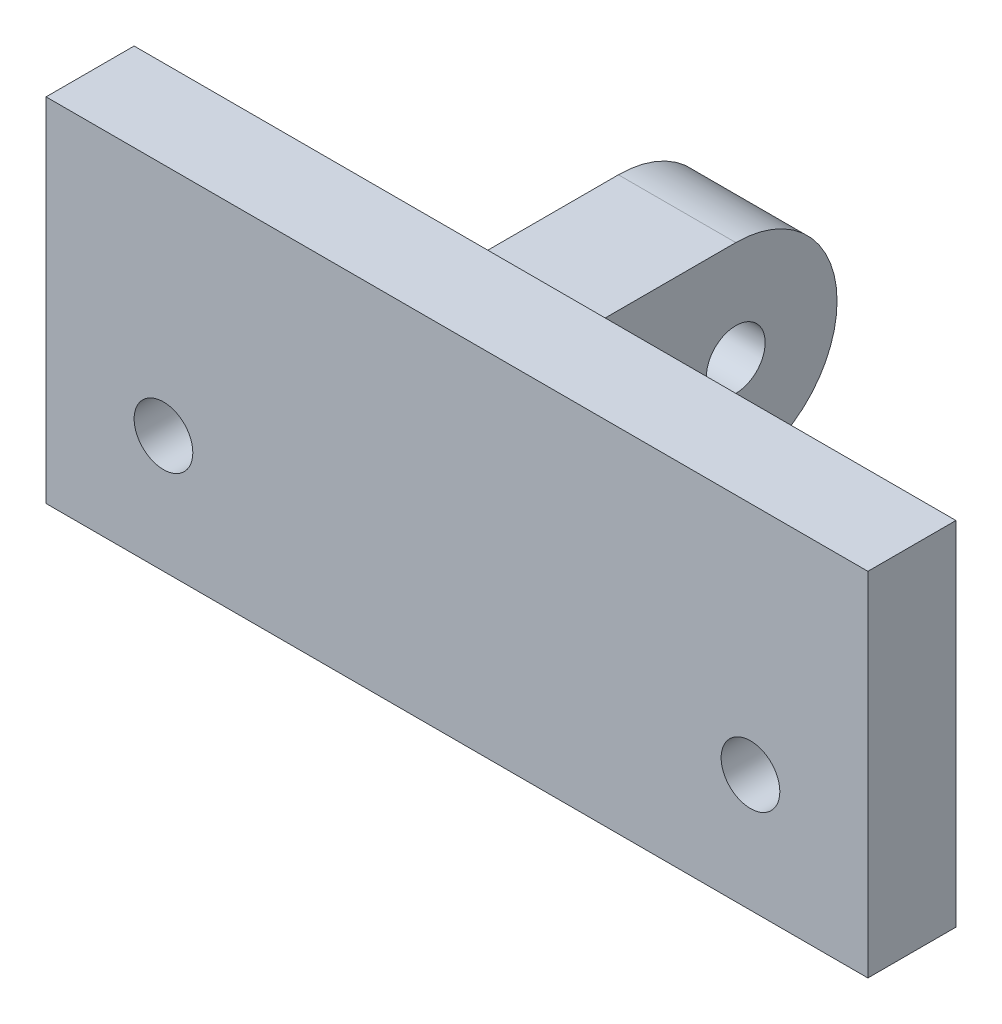
ISO-10303-21;
HEADER;
FILE_DESCRIPTION(('STEP AP214'),'2;1');
FILE_NAME('part.step','',(''),(''),'','','');
FILE_SCHEMA(('AUTOMOTIVE_DESIGN { 1 0 10303 214 1 1 1 1 }'));
ENDSEC;
DATA;
#1=APPLICATION_CONTEXT('core data for automotive mechanical design processes');
#2=APPLICATION_PROTOCOL_DEFINITION('international standard','automotive_design',2000,#1);
#3=PRODUCT_CONTEXT('',#1,'mechanical');
#4=PRODUCT('Part','Part','',(#3));
#5=PRODUCT_RELATED_PRODUCT_CATEGORY('part','',(#4));
#6=PRODUCT_DEFINITION_FORMATION('','',#4);
#7=PRODUCT_DEFINITION_CONTEXT('part definition',#1,'design');
#8=PRODUCT_DEFINITION('design','',#6,#7);
#9=PRODUCT_DEFINITION_SHAPE('','',#8);
#10=(LENGTH_UNIT() NAMED_UNIT(*) SI_UNIT(.MILLI.,.METRE.));
#11=(NAMED_UNIT(*) PLANE_ANGLE_UNIT() SI_UNIT($,.RADIAN.));
#12=(NAMED_UNIT(*) SI_UNIT($,.STERADIAN.) SOLID_ANGLE_UNIT());
#13=UNCERTAINTY_MEASURE_WITH_UNIT(LENGTH_MEASURE(1.E-05),#10,'distance_accuracy_value','');
#14=(GEOMETRIC_REPRESENTATION_CONTEXT(3) GLOBAL_UNCERTAINTY_ASSIGNED_CONTEXT((#13)) GLOBAL_UNIT_ASSIGNED_CONTEXT((#10,
#11,#12)) REPRESENTATION_CONTEXT('',''));
#15=CARTESIAN_POINT('',(0.,0.,0.));
#16=DIRECTION('',(0.,0.,1.));
#17=DIRECTION('',(1.,0.,0.));
#18=AXIS2_PLACEMENT_3D('',#15,#16,#17);
#19=CARTESIAN_POINT('',(0.,0.,0.));
#20=DIRECTION('',(0.,0.,1.));
#21=DIRECTION('',(1.,0.,0.));
#22=AXIS2_PLACEMENT_3D('',#19,#20,#21);
#23=PLANE('',#22);
#24=DIRECTION('',(0.,-1.,0.));
#25=VECTOR('',#24,1.);
#26=CARTESIAN_POINT('',(-30.4122255040452,13.3566433566434,0.));
#27=LINE('',#26,#25);
#28=CARTESIAN_POINT('',(-30.4122255040452,13.3566433566434,0.));
#29=VERTEX_POINT('',#28);
#30=CARTESIAN_POINT('',(-30.4122255040452,1.35664335664336,0.));
#31=VERTEX_POINT('',#30);
#32=EDGE_CURVE('E153',#29,#31,#27,.T.);
#33=ORIENTED_EDGE('',*,*,#32,.F.);
#34=DIRECTION('',(-1.,0.,0.));
#35=VECTOR('',#34,1.);
#36=CARTESIAN_POINT('',(-30.4122255040452,13.3566433566434,0.));
#37=LINE('',#36,#35);
#38=CARTESIAN_POINT('',(-2.41222550404521,13.3566433566434,0.));
#39=VERTEX_POINT('',#38);
#40=EDGE_CURVE('E37',#39,#29,#37,.T.);
#41=ORIENTED_EDGE('',*,*,#40,.F.);
#42=DIRECTION('',(0.,1.,0.));
#43=VECTOR('',#42,1.);
#44=CARTESIAN_POINT('',(-2.41222550404521,13.3566433566434,0.));
#45=LINE('',#44,#43);
#46=CARTESIAN_POINT('',(-2.41222550404521,1.35664335664336,0.));
#47=VERTEX_POINT('',#46);
#48=EDGE_CURVE('E170',#47,#39,#45,.T.);
#49=ORIENTED_EDGE('',*,*,#48,.F.);
#50=DIRECTION('',(1.,0.,0.));
#51=VECTOR('',#50,1.);
#52=CARTESIAN_POINT('',(-30.4122255040452,1.35664335664336,0.));
#53=LINE('',#52,#51);
#54=EDGE_CURVE('E168',#31,#47,#53,.T.);
#55=ORIENTED_EDGE('',*,*,#54,.F.);
#56=EDGE_LOOP('',(#33,#41,#49,#55));
#57=FACE_BOUND('',#56,.T.);
#58=CARTESIAN_POINT('',(-26.4122255040452,5.35664335664336,0.));
#59=DIRECTION('',(0.,0.,1.));
#60=DIRECTION('',(1.,0.,0.));
#61=AXIS2_PLACEMENT_3D('',#58,#59,#60);
#62=CIRCLE('',#61,1.);
#63=CARTESIAN_POINT('',(-25.4122255040452,5.35664335664336,0.));
#64=VERTEX_POINT('',#63);
#65=EDGE_CURVE('E150',#64,#64,#62,.T.);
#66=ORIENTED_EDGE('',*,*,#65,.T.);
#67=EDGE_LOOP('',(#66));
#68=FACE_BOUND('',#67,.T.);
#69=CARTESIAN_POINT('',(-6.41222550404521,5.35664335664336,0.));
#70=DIRECTION('',(0.,0.,1.));
#71=DIRECTION('',(1.,0.,0.));
#72=AXIS2_PLACEMENT_3D('',#69,#70,#71);
#73=CIRCLE('',#72,1.);
#74=CARTESIAN_POINT('',(-5.41222550404521,5.35664335664336,0.));
#75=VERTEX_POINT('',#74);
#76=EDGE_CURVE('E144',#75,#75,#73,.T.);
#77=ORIENTED_EDGE('',*,*,#76,.T.);
#78=EDGE_LOOP('',(#77));
#79=FACE_BOUND('',#78,.T.);
#80=DIRECTION('',(0.,-1.,0.));
#81=VECTOR('',#80,1.);
#82=CARTESIAN_POINT('',(-14.4122255040452,13.3066433566434,0.));
#83=LINE('',#82,#81);
#84=CARTESIAN_POINT('',(-14.4122255040452,13.3066433566434,0.));
#85=VERTEX_POINT('',#84);
#86=CARTESIAN_POINT('',(-14.4122255040452,6.40664335664336,0.));
#87=VERTEX_POINT('',#86);
#88=EDGE_CURVE('E114',#85,#87,#83,.T.);
#89=ORIENTED_EDGE('',*,*,#88,.F.);
#90=DIRECTION('',(-1.,0.,0.));
#91=VECTOR('',#90,1.);
#92=CARTESIAN_POINT('',(-9.91222550404521,13.3066433566434,0.));
#93=LINE('',#92,#91);
#94=CARTESIAN_POINT('',(-18.4122255040452,13.3066433566434,0.));
#95=VERTEX_POINT('',#94);
#96=EDGE_CURVE('E50',#85,#95,#93,.T.);
#97=ORIENTED_EDGE('',*,*,#96,.T.);
#98=DIRECTION('',(0.,1.,0.));
#99=VECTOR('',#98,1.);
#100=CARTESIAN_POINT('',(-18.4122255040452,6.40664335664336,0.));
#101=LINE('',#100,#99);
#102=CARTESIAN_POINT('',(-18.4122255040452,6.40664335664336,0.));
#103=VERTEX_POINT('',#102);
#104=EDGE_CURVE('E135',#103,#95,#101,.T.);
#105=ORIENTED_EDGE('',*,*,#104,.F.);
#106=DIRECTION('',(-1.,0.,0.));
#107=VECTOR('',#106,1.);
#108=CARTESIAN_POINT('',(-9.91222550404521,6.40664335664336,0.));
#109=LINE('',#108,#107);
#110=EDGE_CURVE('E57',#87,#103,#109,.T.);
#111=ORIENTED_EDGE('',*,*,#110,.F.);
#112=EDGE_LOOP('',(#89,#97,#105,#111));
#113=FACE_BOUND('',#112,.T.);
#114=ADVANCED_FACE('F33',(#57,#68,#79,#113),#23,.F.);
#115=CARTESIAN_POINT('',(-30.4122255040452,13.3566433566434,3.));
#116=DIRECTION('',(1.,0.,0.));
#117=DIRECTION('',(0.,0.,-1.));
#118=AXIS2_PLACEMENT_3D('',#115,#116,#117);
#119=PLANE('',#118);
#120=ORIENTED_EDGE('',*,*,#32,.T.);
#121=DIRECTION('',(0.,0.,-1.));
#122=VECTOR('',#121,1.);
#123=CARTESIAN_POINT('',(-30.4122255040452,1.35664335664336,3.));
#124=LINE('',#123,#122);
#125=CARTESIAN_POINT('',(-30.4122255040452,1.35664335664336,3.));
#126=VERTEX_POINT('',#125);
#127=EDGE_CURVE('E11',#126,#31,#124,.T.);
#128=ORIENTED_EDGE('',*,*,#127,.F.);
#129=DIRECTION('',(0.,-1.,0.));
#130=VECTOR('',#129,1.);
#131=CARTESIAN_POINT('',(-30.4122255040452,13.3566433566434,3.));
#132=LINE('',#131,#130);
#133=CARTESIAN_POINT('',(-30.4122255040452,13.3566433566434,3.));
#134=VERTEX_POINT('',#133);
#135=EDGE_CURVE('E156',#134,#126,#132,.T.);
#136=ORIENTED_EDGE('',*,*,#135,.F.);
#137=DIRECTION('',(0.,0.,-1.));
#138=VECTOR('',#137,1.);
#139=CARTESIAN_POINT('',(-30.4122255040452,13.3566433566434,3.));
#140=LINE('',#139,#138);
#141=EDGE_CURVE('E165',#134,#29,#140,.T.);
#142=ORIENTED_EDGE('',*,*,#141,.T.);
#143=EDGE_LOOP('',(#120,#128,#136,#142));
#144=FACE_BOUND('',#143,.T.);
#145=ADVANCED_FACE('F35',(#144),#119,.F.);
#146=CARTESIAN_POINT('',(-30.4122255040452,1.35664335664336,3.));
#147=DIRECTION('',(0.,1.,0.));
#148=DIRECTION('',(0.,0.,1.));
#149=AXIS2_PLACEMENT_3D('',#146,#147,#148);
#150=PLANE('',#149);
#151=ORIENTED_EDGE('',*,*,#54,.T.);
#152=DIRECTION('',(0.,0.,-1.));
#153=VECTOR('',#152,1.);
#154=CARTESIAN_POINT('',(-2.41222550404521,1.35664335664336,3.));
#155=LINE('',#154,#153);
#156=CARTESIAN_POINT('',(-2.41222550404521,1.35664335664336,3.));
#157=VERTEX_POINT('',#156);
#158=EDGE_CURVE('E43',#157,#47,#155,.T.);
#159=ORIENTED_EDGE('',*,*,#158,.F.);
#160=DIRECTION('',(1.,0.,0.));
#161=VECTOR('',#160,1.);
#162=CARTESIAN_POINT('',(-30.4122255040452,1.35664335664336,3.));
#163=LINE('',#162,#161);
#164=EDGE_CURVE('E159',#126,#157,#163,.T.);
#165=ORIENTED_EDGE('',*,*,#164,.F.);
#166=ORIENTED_EDGE('',*,*,#127,.T.);
#167=EDGE_LOOP('',(#151,#159,#165,#166));
#168=FACE_BOUND('',#167,.T.);
#169=ADVANCED_FACE('F199',(#168),#150,.F.);
#170=CARTESIAN_POINT('',(-2.41222550404521,13.3566433566434,3.));
#171=DIRECTION('',(-1.,0.,0.));
#172=DIRECTION('',(0.,0.,1.));
#173=AXIS2_PLACEMENT_3D('',#170,#171,#172);
#174=PLANE('',#173);
#175=ORIENTED_EDGE('',*,*,#48,.T.);
#176=DIRECTION('',(0.,0.,-1.));
#177=VECTOR('',#176,1.);
#178=CARTESIAN_POINT('',(-2.41222550404521,13.3566433566434,3.));
#179=LINE('',#178,#177);
#180=CARTESIAN_POINT('',(-2.41222550404521,13.3566433566434,3.));
#181=VERTEX_POINT('',#180);
#182=EDGE_CURVE('E175',#181,#39,#179,.T.);
#183=ORIENTED_EDGE('',*,*,#182,.F.);
#184=DIRECTION('',(0.,1.,0.));
#185=VECTOR('',#184,1.);
#186=CARTESIAN_POINT('',(-2.41222550404521,13.3566433566434,3.));
#187=LINE('',#186,#185);
#188=EDGE_CURVE('E161',#157,#181,#187,.T.);
#189=ORIENTED_EDGE('',*,*,#188,.F.);
#190=ORIENTED_EDGE('',*,*,#158,.T.);
#191=EDGE_LOOP('',(#175,#183,#189,#190));
#192=FACE_BOUND('',#191,.T.);
#193=ADVANCED_FACE('F183',(#192),#174,.F.);
#194=CARTESIAN_POINT('',(-30.4122255040452,13.3566433566434,3.));
#195=DIRECTION('',(0.,-1.,0.));
#196=DIRECTION('',(0.,0.,-1.));
#197=AXIS2_PLACEMENT_3D('',#194,#195,#196);
#198=PLANE('',#197);
#199=ORIENTED_EDGE('',*,*,#40,.T.);
#200=ORIENTED_EDGE('',*,*,#141,.F.);
#201=DIRECTION('',(-1.,0.,0.));
#202=VECTOR('',#201,1.);
#203=CARTESIAN_POINT('',(-30.4122255040452,13.3566433566434,3.));
#204=LINE('',#203,#202);
#205=EDGE_CURVE('E163',#181,#134,#204,.T.);
#206=ORIENTED_EDGE('',*,*,#205,.F.);
#207=ORIENTED_EDGE('',*,*,#182,.T.);
#208=EDGE_LOOP('',(#199,#200,#206,#207));
#209=FACE_BOUND('',#208,.T.);
#210=ADVANCED_FACE('F192',(#209),#198,.F.);
#211=CARTESIAN_POINT('',(0.,0.,3.));
#212=DIRECTION('',(0.,0.,1.));
#213=DIRECTION('',(1.,0.,0.));
#214=AXIS2_PLACEMENT_3D('',#211,#212,#213);
#215=PLANE('',#214);
#216=CARTESIAN_POINT('',(-6.41222550404521,5.35664335664336,3.));
#217=DIRECTION('',(0.,0.,1.));
#218=DIRECTION('',(1.,0.,0.));
#219=AXIS2_PLACEMENT_3D('',#216,#217,#218);
#220=CIRCLE('',#219,1.);
#221=CARTESIAN_POINT('',(-5.41222550404521,5.35664335664336,3.));
#222=VERTEX_POINT('',#221);
#223=EDGE_CURVE('E141',#222,#222,#220,.T.);
#224=ORIENTED_EDGE('',*,*,#223,.F.);
#225=EDGE_LOOP('',(#224));
#226=FACE_BOUND('',#225,.T.);
#227=CARTESIAN_POINT('',(-26.4122255040452,5.35664335664336,3.));
#228=DIRECTION('',(0.,0.,1.));
#229=DIRECTION('',(1.,0.,0.));
#230=AXIS2_PLACEMENT_3D('',#227,#228,#229);
#231=CIRCLE('',#230,1.);
#232=CARTESIAN_POINT('',(-25.4122255040452,5.35664335664336,3.));
#233=VERTEX_POINT('',#232);
#234=EDGE_CURVE('E147',#233,#233,#231,.T.);
#235=ORIENTED_EDGE('',*,*,#234,.F.);
#236=EDGE_LOOP('',(#235));
#237=FACE_BOUND('',#236,.T.);
#238=ORIENTED_EDGE('',*,*,#135,.T.);
#239=ORIENTED_EDGE('',*,*,#164,.T.);
#240=ORIENTED_EDGE('',*,*,#188,.T.);
#241=ORIENTED_EDGE('',*,*,#205,.T.);
#242=EDGE_LOOP('',(#238,#239,#240,#241));
#243=FACE_BOUND('',#242,.T.);
#244=ADVANCED_FACE('F198',(#226,#237,#243),#215,.T.);
#245=CARTESIAN_POINT('',(-26.4122255040452,5.35664335664336,0.));
#246=DIRECTION('',(0.,0.,1.));
#247=DIRECTION('',(1.,0.,0.));
#248=AXIS2_PLACEMENT_3D('',#245,#246,#247);
#249=CYLINDRICAL_SURFACE('',#248,1.);
#250=ORIENTED_EDGE('',*,*,#65,.F.);
#251=EDGE_LOOP('',(#250));
#252=FACE_BOUND('',#251,.T.);
#253=ORIENTED_EDGE('',*,*,#234,.T.);
#254=EDGE_LOOP('',(#253));
#255=FACE_BOUND('',#254,.T.);
#256=ADVANCED_FACE('F217',(#252,#255),#249,.F.);
#257=CARTESIAN_POINT('',(-6.41222550404521,5.35664335664336,0.));
#258=DIRECTION('',(0.,0.,1.));
#259=DIRECTION('',(1.,0.,0.));
#260=AXIS2_PLACEMENT_3D('',#257,#258,#259);
#261=CYLINDRICAL_SURFACE('',#260,1.);
#262=ORIENTED_EDGE('',*,*,#76,.F.);
#263=EDGE_LOOP('',(#262));
#264=FACE_BOUND('',#263,.T.);
#265=ORIENTED_EDGE('',*,*,#223,.T.);
#266=EDGE_LOOP('',(#265));
#267=FACE_BOUND('',#266,.T.);
#268=ADVANCED_FACE('F222',(#264,#267),#261,.F.);
#269=CARTESIAN_POINT('',(-14.9122255040452,9.85664335664336,-4.5));
#270=DIRECTION('',(-1.,0.,0.));
#271=DIRECTION('',(0.,0.,1.));
#272=AXIS2_PLACEMENT_3D('',#269,#270,#271);
#273=CYLINDRICAL_SURFACE('',#272,1.);
#274=CARTESIAN_POINT('',(-18.4122255040452,9.85664335664336,-4.5));
#275=DIRECTION('',(-1.,0.,0.));
#276=DIRECTION('',(0.,0.,1.));
#277=AXIS2_PLACEMENT_3D('',#274,#275,#276);
#278=CIRCLE('',#277,1.);
#279=CARTESIAN_POINT('',(-18.4122255040452,9.85664335664336,-3.5));
#280=VERTEX_POINT('',#279);
#281=EDGE_CURVE('E128',#280,#280,#278,.T.);
#282=ORIENTED_EDGE('',*,*,#281,.T.);
#283=EDGE_LOOP('',(#282));
#284=FACE_BOUND('',#283,.T.);
#285=CARTESIAN_POINT('',(-14.4122255040452,9.85664335664336,-4.5));
#286=DIRECTION('',(1.,0.,0.));
#287=DIRECTION('',(0.,0.,-1.));
#288=AXIS2_PLACEMENT_3D('',#285,#286,#287);
#289=CIRCLE('',#288,0.999999999999998);
#290=CARTESIAN_POINT('',(-14.4122255040452,9.85664335664336,-5.5));
#291=VERTEX_POINT('',#290);
#292=EDGE_CURVE('E121',#291,#291,#289,.T.);
#293=ORIENTED_EDGE('',*,*,#292,.T.);
#294=EDGE_LOOP('',(#293));
#295=FACE_BOUND('',#294,.T.);
#296=ADVANCED_FACE('F230',(#284,#295),#273,.F.);
#297=CARTESIAN_POINT('',(-9.91222550404521,9.85664335664336,-4.5));
#298=DIRECTION('',(-1.,0.,0.));
#299=DIRECTION('',(0.,0.,1.));
#300=AXIS2_PLACEMENT_3D('',#297,#298,#299);
#301=CYLINDRICAL_SURFACE('',#300,3.45);
#302=DIRECTION('',(-1.,0.,0.));
#303=VECTOR('',#302,1.);
#304=CARTESIAN_POINT('',(-9.91222550404521,6.40664335664336,-4.5));
#305=LINE('',#304,#303);
#306=CARTESIAN_POINT('',(-14.4122255040452,6.40664335664336,-4.50000000000004));
#307=VERTEX_POINT('',#306);
#308=CARTESIAN_POINT('',(-18.4122255040452,6.40664335664336,-4.5));
#309=VERTEX_POINT('',#308);
#310=EDGE_CURVE('E139',#307,#309,#305,.T.);
#311=ORIENTED_EDGE('',*,*,#310,.T.);
#312=CARTESIAN_POINT('',(-18.4122255040452,9.85664335664336,-4.5));
#313=DIRECTION('',(-1.,0.,0.));
#314=DIRECTION('',(0.,0.,-1.));
#315=AXIS2_PLACEMENT_3D('',#312,#313,#314);
#316=CIRCLE('',#315,3.45);
#317=CARTESIAN_POINT('',(-18.4122255040452,13.3066433566434,-4.5));
#318=VERTEX_POINT('',#317);
#319=EDGE_CURVE('E106',#318,#309,#316,.T.);
#320=ORIENTED_EDGE('',*,*,#319,.F.);
#321=DIRECTION('',(-1.,0.,0.));
#322=VECTOR('',#321,1.);
#323=CARTESIAN_POINT('',(-9.91222550404521,13.3066433566434,-4.5));
#324=LINE('',#323,#322);
#325=CARTESIAN_POINT('',(-14.4122255040452,13.3066433566434,-4.49999999999999));
#326=VERTEX_POINT('',#325);
#327=EDGE_CURVE('E101',#326,#318,#324,.T.);
#328=ORIENTED_EDGE('',*,*,#327,.F.);
#329=CARTESIAN_POINT('',(-14.4122255040452,9.85664335664336,-4.5));
#330=DIRECTION('',(1.,0.,0.));
#331=DIRECTION('',(0.,0.,1.));
#332=AXIS2_PLACEMENT_3D('',#329,#330,#331);
#333=CIRCLE('',#332,3.45);
#334=EDGE_CURVE('E104',#307,#326,#333,.T.);
#335=ORIENTED_EDGE('',*,*,#334,.F.);
#336=EDGE_LOOP('',(#311,#320,#328,#335));
#337=FACE_BOUND('',#336,.T.);
#338=ADVANCED_FACE('F102',(#337),#301,.T.);
#339=CARTESIAN_POINT('',(-9.91222550404521,6.40664335664336,-4.5));
#340=DIRECTION('',(0.,1.,0.));
#341=DIRECTION('',(0.,0.,1.));
#342=AXIS2_PLACEMENT_3D('',#339,#340,#341);
#343=PLANE('',#342);
#344=ORIENTED_EDGE('',*,*,#110,.T.);
#345=DIRECTION('',(0.,0.,1.));
#346=VECTOR('',#345,1.);
#347=CARTESIAN_POINT('',(-18.4122255040452,6.40664335664336,-4.5));
#348=LINE('',#347,#346);
#349=EDGE_CURVE('E132',#309,#103,#348,.T.);
#350=ORIENTED_EDGE('',*,*,#349,.F.);
#351=ORIENTED_EDGE('',*,*,#310,.F.);
#352=DIRECTION('',(0.,0.,-1.));
#353=VECTOR('',#352,1.);
#354=CARTESIAN_POINT('',(-14.4122255040452,6.40664335664336,0.));
#355=LINE('',#354,#353);
#356=EDGE_CURVE('E120',#87,#307,#355,.T.);
#357=ORIENTED_EDGE('',*,*,#356,.F.);
#358=EDGE_LOOP('',(#344,#350,#351,#357));
#359=FACE_BOUND('',#358,.T.);
#360=ADVANCED_FACE('F242',(#359),#343,.F.);
#361=CARTESIAN_POINT('',(-9.91222550404521,13.3066433566434,0.));
#362=DIRECTION('',(0.,-1.,0.));
#363=DIRECTION('',(0.,0.,-1.));
#364=AXIS2_PLACEMENT_3D('',#361,#362,#363);
#365=PLANE('',#364);
#366=ORIENTED_EDGE('',*,*,#327,.T.);
#367=DIRECTION('',(0.,0.,-1.));
#368=VECTOR('',#367,1.);
#369=CARTESIAN_POINT('',(-18.4122255040452,13.3066433566434,0.));
#370=LINE('',#369,#368);
#371=EDGE_CURVE('E108',#95,#318,#370,.T.);
#372=ORIENTED_EDGE('',*,*,#371,.F.);
#373=ORIENTED_EDGE('',*,*,#96,.F.);
#374=DIRECTION('',(0.,0.,1.));
#375=VECTOR('',#374,1.);
#376=CARTESIAN_POINT('',(-14.4122255040452,13.3066433566434,-4.49999999999999));
#377=LINE('',#376,#375);
#378=EDGE_CURVE('E111',#326,#85,#377,.T.);
#379=ORIENTED_EDGE('',*,*,#378,.F.);
#380=EDGE_LOOP('',(#366,#372,#373,#379));
#381=FACE_BOUND('',#380,.T.);
#382=ADVANCED_FACE('F112',(#381),#365,.F.);
#383=CARTESIAN_POINT('',(-18.4122255040452,9.85664335664336,-4.5));
#384=DIRECTION('',(1.,0.,0.));
#385=DIRECTION('',(0.,0.,-1.));
#386=AXIS2_PLACEMENT_3D('',#383,#384,#385);
#387=PLANE('',#386);
#388=ORIENTED_EDGE('',*,*,#319,.T.);
#389=ORIENTED_EDGE('',*,*,#349,.T.);
#390=ORIENTED_EDGE('',*,*,#104,.T.);
#391=ORIENTED_EDGE('',*,*,#371,.T.);
#392=EDGE_LOOP('',(#388,#389,#390,#391));
#393=FACE_BOUND('',#392,.T.);
#394=ORIENTED_EDGE('',*,*,#281,.F.);
#395=EDGE_LOOP('',(#394));
#396=FACE_BOUND('',#395,.T.);
#397=ADVANCED_FACE('F245',(#393,#396),#387,.F.);
#398=CARTESIAN_POINT('',(-14.4122255040452,9.85664335664336,-4.5));
#399=DIRECTION('',(-1.,0.,0.));
#400=DIRECTION('',(0.,0.,1.));
#401=AXIS2_PLACEMENT_3D('',#398,#399,#400);
#402=PLANE('',#401);
#403=ORIENTED_EDGE('',*,*,#334,.T.);
#404=ORIENTED_EDGE('',*,*,#378,.T.);
#405=ORIENTED_EDGE('',*,*,#88,.T.);
#406=ORIENTED_EDGE('',*,*,#356,.T.);
#407=EDGE_LOOP('',(#403,#404,#405,#406));
#408=FACE_BOUND('',#407,.T.);
#409=ORIENTED_EDGE('',*,*,#292,.F.);
#410=EDGE_LOOP('',(#409));
#411=FACE_BOUND('',#410,.T.);
#412=ADVANCED_FACE('F117',(#408,#411),#402,.F.);
#413=CLOSED_SHELL('',(#114,#145,#169,#193,#210,#244,#256,#268,#296,#338,#360,#382,#397,#412));
#414=MANIFOLD_SOLID_BREP('B2',#413);
#415=ADVANCED_BREP_SHAPE_REPRESENTATION('',(#18,#414),#14);
#416=SHAPE_DEFINITION_REPRESENTATION(#9,#415);
ENDSEC;
END-ISO-10303-21;
